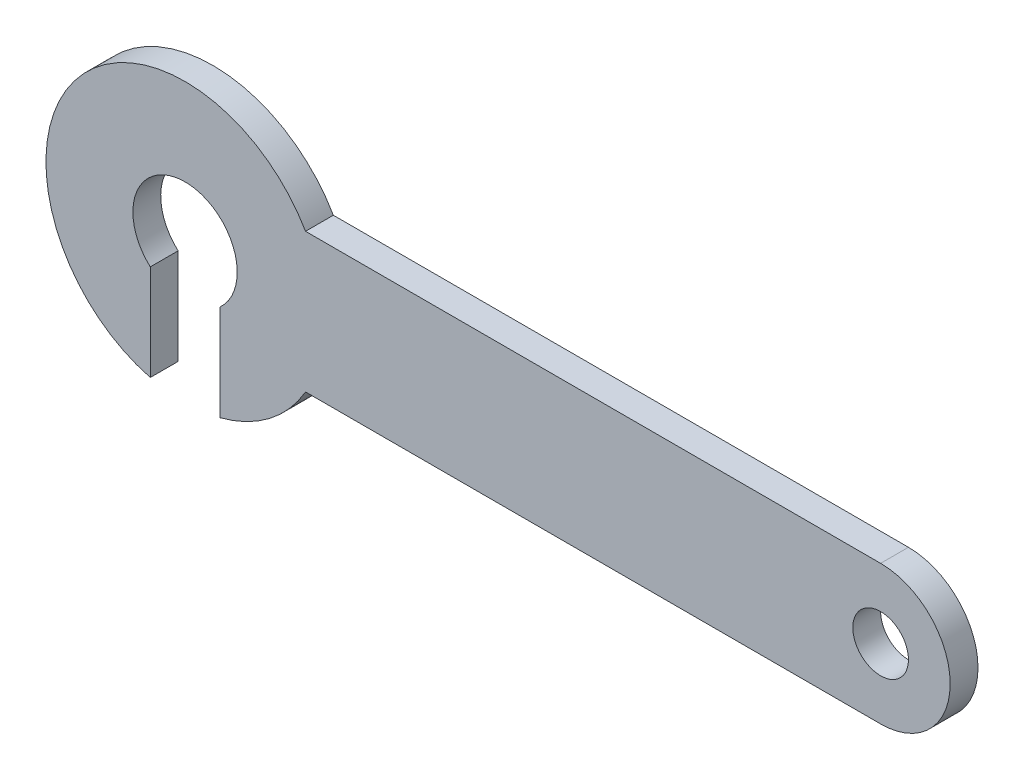
ISO-10303-21;
HEADER;
FILE_DESCRIPTION(('STEP AP214'),'2;1');
FILE_NAME('part.step','',(''),(''),'','','');
FILE_SCHEMA(('AUTOMOTIVE_DESIGN { 1 0 10303 214 1 1 1 1 }'));
ENDSEC;
DATA;
#1=APPLICATION_CONTEXT('core data for automotive mechanical design processes');
#2=APPLICATION_PROTOCOL_DEFINITION('international standard','automotive_design',2000,#1);
#3=PRODUCT_CONTEXT('',#1,'mechanical');
#4=PRODUCT('Part','Part','',(#3));
#5=PRODUCT_RELATED_PRODUCT_CATEGORY('part','',(#4));
#6=PRODUCT_DEFINITION_FORMATION('','',#4);
#7=PRODUCT_DEFINITION_CONTEXT('part definition',#1,'design');
#8=PRODUCT_DEFINITION('design','',#6,#7);
#9=PRODUCT_DEFINITION_SHAPE('','',#8);
#10=(LENGTH_UNIT() NAMED_UNIT(*) SI_UNIT(.MILLI.,.METRE.));
#11=(NAMED_UNIT(*) PLANE_ANGLE_UNIT() SI_UNIT($,.RADIAN.));
#12=(NAMED_UNIT(*) SI_UNIT($,.STERADIAN.) SOLID_ANGLE_UNIT());
#13=UNCERTAINTY_MEASURE_WITH_UNIT(LENGTH_MEASURE(1.E-05),#10,'distance_accuracy_value','');
#14=(GEOMETRIC_REPRESENTATION_CONTEXT(3) GLOBAL_UNCERTAINTY_ASSIGNED_CONTEXT((#13)) GLOBAL_UNIT_ASSIGNED_CONTEXT((#10,
#11,#12)) REPRESENTATION_CONTEXT('',''));
#15=CARTESIAN_POINT('',(0.,0.,0.));
#16=DIRECTION('',(0.,0.,1.));
#17=DIRECTION('',(1.,0.,0.));
#18=AXIS2_PLACEMENT_3D('',#15,#16,#17);
#19=CARTESIAN_POINT('',(0.,0.,4.));
#20=DIRECTION('',(0.,0.,-1.));
#21=DIRECTION('',(-1.,0.,0.));
#22=AXIS2_PLACEMENT_3D('',#19,#20,#21);
#23=CYLINDRICAL_SURFACE('',#22,20.);
#24=DIRECTION('',(0.,0.,-1.));
#25=VECTOR('',#24,1.);
#26=CARTESIAN_POINT('',(-5.,-19.3649167310371,4.));
#27=LINE('',#26,#25);
#28=CARTESIAN_POINT('',(-5.,-19.3649167310371,4.));
#29=VERTEX_POINT('',#28);
#30=CARTESIAN_POINT('',(-5.,-19.3649167310371,0.));
#31=VERTEX_POINT('',#30);
#32=EDGE_CURVE('E97',#29,#31,#27,.T.);
#33=ORIENTED_EDGE('',*,*,#32,.F.);
#34=CARTESIAN_POINT('',(0.,0.,4.));
#35=DIRECTION('',(0.,0.,1.));
#36=DIRECTION('',(1.,0.,0.));
#37=AXIS2_PLACEMENT_3D('',#34,#35,#36);
#38=CIRCLE('',#37,20.);
#39=CARTESIAN_POINT('',(17.3205080756888,10.,4.));
#40=VERTEX_POINT('',#39);
#41=EDGE_CURVE('E162',#40,#29,#38,.T.);
#42=ORIENTED_EDGE('',*,*,#41,.F.);
#43=DIRECTION('',(0.,0.,-1.));
#44=VECTOR('',#43,1.);
#45=CARTESIAN_POINT('',(17.3205080756888,10.,4.));
#46=LINE('',#45,#44);
#47=CARTESIAN_POINT('',(17.3205080756888,10.,0.));
#48=VERTEX_POINT('',#47);
#49=EDGE_CURVE('E119',#40,#48,#46,.T.);
#50=ORIENTED_EDGE('',*,*,#49,.T.);
#51=CARTESIAN_POINT('',(0.,0.,0.));
#52=DIRECTION('',(0.,0.,1.));
#53=DIRECTION('',(1.,0.,0.));
#54=AXIS2_PLACEMENT_3D('',#51,#52,#53);
#55=CIRCLE('',#54,20.);
#56=EDGE_CURVE('E113',#48,#31,#55,.T.);
#57=ORIENTED_EDGE('',*,*,#56,.T.);
#58=EDGE_LOOP('',(#33,#42,#50,#57));
#59=FACE_BOUND('',#58,.T.);
#60=ADVANCED_FACE('F35',(#59),#23,.T.);
#61=DIRECTION('',(0.,0.,-1.));
#62=VECTOR('',#61,1.);
#63=CARTESIAN_POINT('',(5.,-19.3649167310371,4.));
#64=LINE('',#63,#62);
#65=CARTESIAN_POINT('',(5.,-19.3649167310371,0.));
#66=VERTEX_POINT('',#65);
#67=CARTESIAN_POINT('',(5.,-19.3649167310371,4.));
#68=VERTEX_POINT('',#67);
#69=EDGE_CURVE('E106',#66,#68,#64,.F.);
#70=ORIENTED_EDGE('',*,*,#69,.F.);
#71=CARTESIAN_POINT('',(17.3205080756888,-10.,0.));
#72=VERTEX_POINT('',#71);
#73=EDGE_CURVE('E121',#66,#72,#55,.T.);
#74=ORIENTED_EDGE('',*,*,#73,.T.);
#75=DIRECTION('',(0.,0.,-1.));
#76=VECTOR('',#75,1.);
#77=CARTESIAN_POINT('',(17.3205080756888,-10.,4.));
#78=LINE('',#77,#76);
#79=CARTESIAN_POINT('',(17.3205080756888,-10.,4.));
#80=VERTEX_POINT('',#79);
#81=EDGE_CURVE('E138',#80,#72,#78,.T.);
#82=ORIENTED_EDGE('',*,*,#81,.F.);
#83=EDGE_CURVE('E161',#68,#80,#38,.T.);
#84=ORIENTED_EDGE('',*,*,#83,.F.);
#85=EDGE_LOOP('',(#70,#74,#82,#84));
#86=FACE_BOUND('',#85,.T.);
#87=ADVANCED_FACE('F181',(#86),#23,.T.);
#88=CARTESIAN_POINT('',(0.,0.,4.));
#89=DIRECTION('',(0.,0.,1.));
#90=DIRECTION('',(1.,0.,0.));
#91=AXIS2_PLACEMENT_3D('',#88,#89,#90);
#92=PLANE('',#91);
#93=CARTESIAN_POINT('',(100.,0.,4.));
#94=DIRECTION('',(0.,0.,1.));
#95=DIRECTION('',(1.,0.,0.));
#96=AXIS2_PLACEMENT_3D('',#93,#94,#95);
#97=CIRCLE('',#96,4.00000000000001);
#98=CARTESIAN_POINT('',(104.,0.,4.));
#99=VERTEX_POINT('',#98);
#100=EDGE_CURVE('E152',#99,#99,#97,.T.);
#101=ORIENTED_EDGE('',*,*,#100,.F.);
#102=EDGE_LOOP('',(#101));
#103=FACE_BOUND('',#102,.T.);
#104=ORIENTED_EDGE('',*,*,#41,.T.);
#105=DIRECTION('',(0.,-1.,0.));
#106=VECTOR('',#105,1.);
#107=CARTESIAN_POINT('',(-5.,-24.9160956572593,4.));
#108=LINE('',#107,#106);
#109=CARTESIAN_POINT('',(-5.,-5.59016994374947,4.));
#110=VERTEX_POINT('',#109);
#111=EDGE_CURVE('E100',#110,#29,#108,.T.);
#112=ORIENTED_EDGE('',*,*,#111,.F.);
#113=CARTESIAN_POINT('',(0.,0.,4.));
#114=DIRECTION('',(0.,0.,1.));
#115=DIRECTION('',(1.,0.,0.));
#116=AXIS2_PLACEMENT_3D('',#113,#114,#115);
#117=CIRCLE('',#116,7.5);
#118=CARTESIAN_POINT('',(5.,-5.59016994374948,4.));
#119=VERTEX_POINT('',#118);
#120=EDGE_CURVE('E145',#119,#110,#117,.T.);
#121=ORIENTED_EDGE('',*,*,#120,.F.);
#122=DIRECTION('',(0.,1.,0.));
#123=VECTOR('',#122,1.);
#124=CARTESIAN_POINT('',(5.,-24.9160956572593,4.));
#125=LINE('',#124,#123);
#126=EDGE_CURVE('E57',#68,#119,#125,.T.);
#127=ORIENTED_EDGE('',*,*,#126,.F.);
#128=ORIENTED_EDGE('',*,*,#83,.T.);
#129=DIRECTION('',(-1.,0.,0.));
#130=VECTOR('',#129,1.);
#131=CARTESIAN_POINT('',(0.,-10.,4.));
#132=LINE('',#131,#130);
#133=CARTESIAN_POINT('',(100.,-9.99999999999999,4.));
#134=VERTEX_POINT('',#133);
#135=EDGE_CURVE('E164',#134,#80,#132,.T.);
#136=ORIENTED_EDGE('',*,*,#135,.F.);
#137=CARTESIAN_POINT('',(100.,0.,4.));
#138=DIRECTION('',(0.,0.,1.));
#139=DIRECTION('',(1.,0.,0.));
#140=AXIS2_PLACEMENT_3D('',#137,#138,#139);
#141=CIRCLE('',#140,10.);
#142=CARTESIAN_POINT('',(100.,10.,4.));
#143=VERTEX_POINT('',#142);
#144=EDGE_CURVE('E136',#134,#143,#141,.T.);
#145=ORIENTED_EDGE('',*,*,#144,.T.);
#146=DIRECTION('',(1.,0.,0.));
#147=VECTOR('',#146,1.);
#148=CARTESIAN_POINT('',(0.,10.,4.));
#149=LINE('',#148,#147);
#150=EDGE_CURVE('E132',#40,#143,#149,.T.);
#151=ORIENTED_EDGE('',*,*,#150,.F.);
#152=EDGE_LOOP('',(#104,#112,#121,#127,#128,#136,#145,#151));
#153=FACE_BOUND('',#152,.T.);
#154=ADVANCED_FACE('F147',(#103,#153),#92,.T.);
#155=CARTESIAN_POINT('',(0.,0.,0.));
#156=DIRECTION('',(0.,0.,1.));
#157=DIRECTION('',(1.,0.,0.));
#158=AXIS2_PLACEMENT_3D('',#155,#156,#157);
#159=PLANE('',#158);
#160=CARTESIAN_POINT('',(100.,0.,0.));
#161=DIRECTION('',(0.,0.,1.));
#162=DIRECTION('',(1.,0.,0.));
#163=AXIS2_PLACEMENT_3D('',#160,#161,#162);
#164=CIRCLE('',#163,4.00000000000001);
#165=CARTESIAN_POINT('',(104.,0.,0.));
#166=VERTEX_POINT('',#165);
#167=EDGE_CURVE('E149',#166,#166,#164,.T.);
#168=ORIENTED_EDGE('',*,*,#167,.T.);
#169=EDGE_LOOP('',(#168));
#170=FACE_BOUND('',#169,.T.);
#171=DIRECTION('',(0.,-1.,0.));
#172=VECTOR('',#171,1.);
#173=CARTESIAN_POINT('',(-5.,-24.9160956572593,0.));
#174=LINE('',#173,#172);
#175=CARTESIAN_POINT('',(-5.,-5.59016994374947,0.));
#176=VERTEX_POINT('',#175);
#177=EDGE_CURVE('E50',#176,#31,#174,.T.);
#178=ORIENTED_EDGE('',*,*,#177,.T.);
#179=ORIENTED_EDGE('',*,*,#56,.F.);
#180=DIRECTION('',(1.,0.,0.));
#181=VECTOR('',#180,1.);
#182=CARTESIAN_POINT('',(0.,10.,0.));
#183=LINE('',#182,#181);
#184=CARTESIAN_POINT('',(100.,10.,0.));
#185=VERTEX_POINT('',#184);
#186=EDGE_CURVE('E126',#48,#185,#183,.T.);
#187=ORIENTED_EDGE('',*,*,#186,.T.);
#188=CARTESIAN_POINT('',(100.,0.,0.));
#189=DIRECTION('',(0.,0.,1.));
#190=DIRECTION('',(1.,0.,0.));
#191=AXIS2_PLACEMENT_3D('',#188,#189,#190);
#192=CIRCLE('',#191,10.);
#193=CARTESIAN_POINT('',(100.,-9.99999999999999,0.));
#194=VERTEX_POINT('',#193);
#195=EDGE_CURVE('E124',#194,#185,#192,.T.);
#196=ORIENTED_EDGE('',*,*,#195,.F.);
#197=DIRECTION('',(-1.,0.,0.));
#198=VECTOR('',#197,1.);
#199=CARTESIAN_POINT('',(0.,-10.,0.));
#200=LINE('',#199,#198);
#201=EDGE_CURVE('E120',#194,#72,#200,.T.);
#202=ORIENTED_EDGE('',*,*,#201,.T.);
#203=ORIENTED_EDGE('',*,*,#73,.F.);
#204=DIRECTION('',(0.,1.,0.));
#205=VECTOR('',#204,1.);
#206=CARTESIAN_POINT('',(5.,-24.9160956572593,0.));
#207=LINE('',#206,#205);
#208=CARTESIAN_POINT('',(5.,-5.59016994374948,0.));
#209=VERTEX_POINT('',#208);
#210=EDGE_CURVE('E117',#66,#209,#207,.T.);
#211=ORIENTED_EDGE('',*,*,#210,.T.);
#212=CARTESIAN_POINT('',(0.,0.,0.));
#213=DIRECTION('',(0.,0.,1.));
#214=DIRECTION('',(1.,0.,0.));
#215=AXIS2_PLACEMENT_3D('',#212,#213,#214);
#216=CIRCLE('',#215,7.5);
#217=EDGE_CURVE('E105',#209,#176,#216,.T.);
#218=ORIENTED_EDGE('',*,*,#217,.T.);
#219=EDGE_LOOP('',(#178,#179,#187,#196,#202,#203,#211,#218));
#220=FACE_BOUND('',#219,.T.);
#221=ADVANCED_FACE('F111',(#170,#220),#159,.F.);
#222=CARTESIAN_POINT('',(0.,0.,4.));
#223=DIRECTION('',(0.,0.,-1.));
#224=DIRECTION('',(-1.,0.,0.));
#225=AXIS2_PLACEMENT_3D('',#222,#223,#224);
#226=CYLINDRICAL_SURFACE('',#225,7.5);
#227=ORIENTED_EDGE('',*,*,#120,.T.);
#228=DIRECTION('',(0.,0.,-1.));
#229=VECTOR('',#228,1.);
#230=CARTESIAN_POINT('',(-5.,-5.59016994374947,4.));
#231=LINE('',#230,#229);
#232=EDGE_CURVE('E11',#110,#176,#231,.T.);
#233=ORIENTED_EDGE('',*,*,#232,.T.);
#234=ORIENTED_EDGE('',*,*,#217,.F.);
#235=DIRECTION('',(0.,0.,-1.));
#236=VECTOR('',#235,1.);
#237=CARTESIAN_POINT('',(5.,-5.59016994374948,4.));
#238=LINE('',#237,#236);
#239=EDGE_CURVE('E43',#209,#119,#238,.F.);
#240=ORIENTED_EDGE('',*,*,#239,.T.);
#241=EDGE_LOOP('',(#227,#233,#234,#240));
#242=FACE_BOUND('',#241,.T.);
#243=ADVANCED_FACE('F144',(#242),#226,.F.);
#244=CARTESIAN_POINT('',(0.,10.,4.));
#245=DIRECTION('',(0.,1.,0.));
#246=DIRECTION('',(0.,0.,1.));
#247=AXIS2_PLACEMENT_3D('',#244,#245,#246);
#248=PLANE('',#247);
#249=ORIENTED_EDGE('',*,*,#186,.F.);
#250=ORIENTED_EDGE('',*,*,#49,.F.);
#251=ORIENTED_EDGE('',*,*,#150,.T.);
#252=DIRECTION('',(0.,0.,-1.));
#253=VECTOR('',#252,1.);
#254=CARTESIAN_POINT('',(100.,10.,4.));
#255=LINE('',#254,#253);
#256=EDGE_CURVE('E133',#143,#185,#255,.T.);
#257=ORIENTED_EDGE('',*,*,#256,.T.);
#258=EDGE_LOOP('',(#249,#250,#251,#257));
#259=FACE_BOUND('',#258,.T.);
#260=ADVANCED_FACE('F37',(#259),#248,.T.);
#261=CARTESIAN_POINT('',(0.,-10.,4.));
#262=DIRECTION('',(0.,-1.,0.));
#263=DIRECTION('',(1.,0.,0.));
#264=AXIS2_PLACEMENT_3D('',#261,#262,#263);
#265=PLANE('',#264);
#266=ORIENTED_EDGE('',*,*,#201,.F.);
#267=DIRECTION('',(0.,0.,-1.));
#268=VECTOR('',#267,1.);
#269=CARTESIAN_POINT('',(100.,-9.99999999999999,4.));
#270=LINE('',#269,#268);
#271=EDGE_CURVE('E135',#134,#194,#270,.T.);
#272=ORIENTED_EDGE('',*,*,#271,.F.);
#273=ORIENTED_EDGE('',*,*,#135,.T.);
#274=ORIENTED_EDGE('',*,*,#81,.T.);
#275=EDGE_LOOP('',(#266,#272,#273,#274));
#276=FACE_BOUND('',#275,.T.);
#277=ADVANCED_FACE('F177',(#276),#265,.T.);
#278=CARTESIAN_POINT('',(100.,0.,4.));
#279=DIRECTION('',(0.,0.,-1.));
#280=DIRECTION('',(-1.,0.,0.));
#281=AXIS2_PLACEMENT_3D('',#278,#279,#280);
#282=CYLINDRICAL_SURFACE('',#281,10.);
#283=ORIENTED_EDGE('',*,*,#195,.T.);
#284=ORIENTED_EDGE('',*,*,#256,.F.);
#285=ORIENTED_EDGE('',*,*,#144,.F.);
#286=ORIENTED_EDGE('',*,*,#271,.T.);
#287=EDGE_LOOP('',(#283,#284,#285,#286));
#288=FACE_BOUND('',#287,.T.);
#289=ADVANCED_FACE('F171',(#288),#282,.T.);
#290=CARTESIAN_POINT('',(100.,0.,4.));
#291=DIRECTION('',(0.,0.,-1.));
#292=DIRECTION('',(-1.,0.,0.));
#293=AXIS2_PLACEMENT_3D('',#290,#291,#292);
#294=CYLINDRICAL_SURFACE('',#293,4.00000000000001);
#295=ORIENTED_EDGE('',*,*,#100,.T.);
#296=EDGE_LOOP('',(#295));
#297=FACE_BOUND('',#296,.T.);
#298=ORIENTED_EDGE('',*,*,#167,.F.);
#299=EDGE_LOOP('',(#298));
#300=FACE_BOUND('',#299,.T.);
#301=ADVANCED_FACE('F187',(#297,#300),#294,.F.);
#302=CARTESIAN_POINT('',(5.,-24.9160956572593,4.));
#303=DIRECTION('',(-1.,0.,0.));
#304=DIRECTION('',(0.,0.,1.));
#305=AXIS2_PLACEMENT_3D('',#302,#303,#304);
#306=PLANE('',#305);
#307=ORIENTED_EDGE('',*,*,#69,.T.);
#308=ORIENTED_EDGE('',*,*,#126,.T.);
#309=ORIENTED_EDGE('',*,*,#239,.F.);
#310=ORIENTED_EDGE('',*,*,#210,.F.);
#311=EDGE_LOOP('',(#307,#308,#309,#310));
#312=FACE_BOUND('',#311,.T.);
#313=ADVANCED_FACE('F185',(#312),#306,.T.);
#314=CARTESIAN_POINT('',(-5.,-24.9160956572593,4.));
#315=DIRECTION('',(1.,0.,0.));
#316=DIRECTION('',(0.,1.,0.));
#317=AXIS2_PLACEMENT_3D('',#314,#315,#316);
#318=PLANE('',#317);
#319=ORIENTED_EDGE('',*,*,#32,.T.);
#320=ORIENTED_EDGE('',*,*,#177,.F.);
#321=ORIENTED_EDGE('',*,*,#232,.F.);
#322=ORIENTED_EDGE('',*,*,#111,.T.);
#323=EDGE_LOOP('',(#319,#320,#321,#322));
#324=FACE_BOUND('',#323,.T.);
#325=ADVANCED_FACE('F98',(#324),#318,.T.);
#326=CLOSED_SHELL('',(#60,#87,#154,#221,#243,#260,#277,#289,#301,#313,#325));
#327=MANIFOLD_SOLID_BREP('B2',#326);
#328=ADVANCED_BREP_SHAPE_REPRESENTATION('',(#18,#327),#14);
#329=SHAPE_DEFINITION_REPRESENTATION(#9,#328);
ENDSEC;
END-ISO-10303-21;
